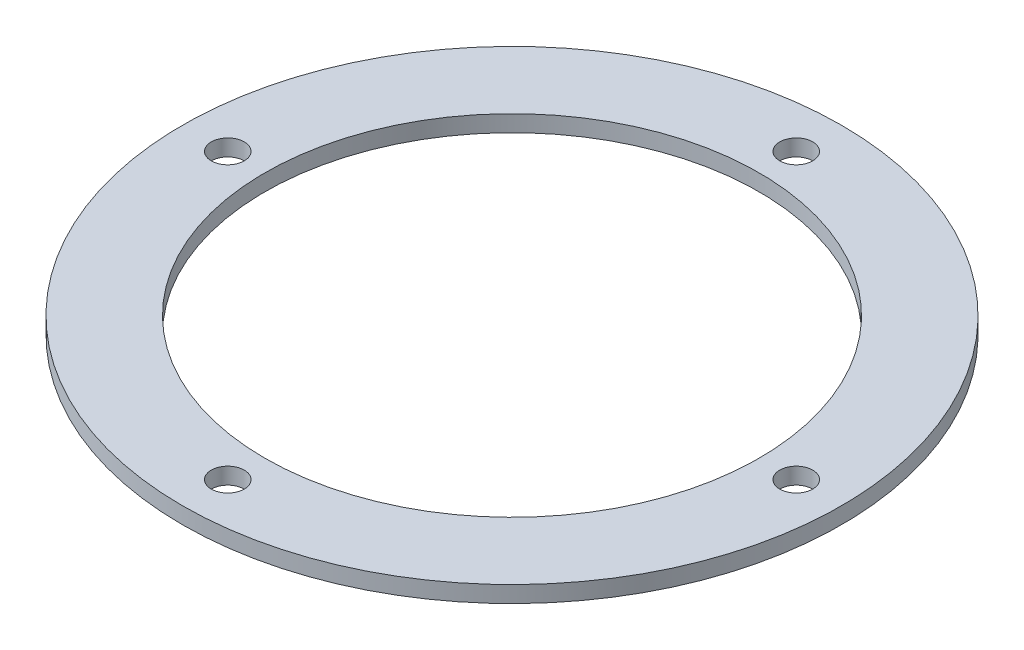
ISO-10303-21;
HEADER;
FILE_DESCRIPTION(('STEP AP214'),'2;1');
FILE_NAME('part.step','',(''),(''),'','','');
FILE_SCHEMA(('AUTOMOTIVE_DESIGN { 1 0 10303 214 1 1 1 1 }'));
ENDSEC;
DATA;
#1=APPLICATION_CONTEXT('core data for automotive mechanical design processes');
#2=APPLICATION_PROTOCOL_DEFINITION('international standard','automotive_design',2000,#1);
#3=PRODUCT_CONTEXT('',#1,'mechanical');
#4=PRODUCT('Part','Part','',(#3));
#5=PRODUCT_RELATED_PRODUCT_CATEGORY('part','',(#4));
#6=PRODUCT_DEFINITION_FORMATION('','',#4);
#7=PRODUCT_DEFINITION_CONTEXT('part definition',#1,'design');
#8=PRODUCT_DEFINITION('design','',#6,#7);
#9=PRODUCT_DEFINITION_SHAPE('','',#8);
#10=(LENGTH_UNIT() NAMED_UNIT(*) SI_UNIT(.MILLI.,.METRE.));
#11=(NAMED_UNIT(*) PLANE_ANGLE_UNIT() SI_UNIT($,.RADIAN.));
#12=(NAMED_UNIT(*) SI_UNIT($,.STERADIAN.) SOLID_ANGLE_UNIT());
#13=UNCERTAINTY_MEASURE_WITH_UNIT(LENGTH_MEASURE(1.E-05),#10,'distance_accuracy_value','');
#14=(GEOMETRIC_REPRESENTATION_CONTEXT(3) GLOBAL_UNCERTAINTY_ASSIGNED_CONTEXT((#13)) GLOBAL_UNIT_ASSIGNED_CONTEXT((#10,
#11,#12)) REPRESENTATION_CONTEXT('',''));
#15=CARTESIAN_POINT('',(0.,0.,0.));
#16=DIRECTION('',(0.,0.,1.));
#17=DIRECTION('',(1.,0.,0.));
#18=AXIS2_PLACEMENT_3D('',#15,#16,#17);
#19=CARTESIAN_POINT('',(0.,2.,0.));
#20=DIRECTION('',(0.,1.,0.));
#21=DIRECTION('',(0.,0.,1.));
#22=AXIS2_PLACEMENT_3D('',#19,#20,#21);
#23=PLANE('',#22);
#24=CARTESIAN_POINT('',(1.9484228563267E-12,2.,34.5));
#25=DIRECTION('',(0.,1.,0.));
#26=DIRECTION('',(0.,0.,1.));
#27=AXIS2_PLACEMENT_3D('',#24,#25,#26);
#28=CIRCLE('',#27,2.);
#29=CARTESIAN_POINT('',(1.9484228563267E-12,2.,36.5));
#30=VERTEX_POINT('',#29);
#31=EDGE_CURVE('E66',#30,#30,#28,.T.);
#32=ORIENTED_EDGE('',*,*,#31,.F.);
#33=EDGE_LOOP('',(#32));
#34=FACE_BOUND('',#33,.T.);
#35=CARTESIAN_POINT('',(0.,2.,-34.5));
#36=DIRECTION('',(0.,1.,0.));
#37=DIRECTION('',(0.,0.,1.));
#38=AXIS2_PLACEMENT_3D('',#35,#36,#37);
#39=CIRCLE('',#38,2.);
#40=CARTESIAN_POINT('',(0.,2.,-32.5));
#41=VERTEX_POINT('',#40);
#42=EDGE_CURVE('E54',#41,#41,#39,.T.);
#43=ORIENTED_EDGE('',*,*,#42,.F.);
#44=EDGE_LOOP('',(#43));
#45=FACE_BOUND('',#44,.T.);
#46=CARTESIAN_POINT('',(0.,2.,0.));
#47=DIRECTION('',(0.,1.,0.));
#48=DIRECTION('',(0.,0.,1.));
#49=AXIS2_PLACEMENT_3D('',#46,#47,#48);
#50=CIRCLE('',#49,40.);
#51=CARTESIAN_POINT('',(0.,2.,40.));
#52=VERTEX_POINT('',#51);
#53=EDGE_CURVE('E10',#52,#52,#50,.T.);
#54=ORIENTED_EDGE('',*,*,#53,.T.);
#55=EDGE_LOOP('',(#54));
#56=FACE_BOUND('',#55,.T.);
#57=CARTESIAN_POINT('',(0.,2.,0.));
#58=DIRECTION('',(0.,1.,0.));
#59=DIRECTION('',(0.,0.,1.));
#60=AXIS2_PLACEMENT_3D('',#57,#58,#59);
#61=CIRCLE('',#60,30.);
#62=CARTESIAN_POINT('',(0.,2.,30.));
#63=VERTEX_POINT('',#62);
#64=EDGE_CURVE('E49',#63,#63,#61,.T.);
#65=ORIENTED_EDGE('',*,*,#64,.F.);
#66=EDGE_LOOP('',(#65));
#67=FACE_BOUND('',#66,.T.);
#68=CARTESIAN_POINT('',(34.500000000001,2.,-9.74211428163351E-13));
#69=DIRECTION('',(0.,1.,0.));
#70=DIRECTION('',(0.,0.,1.));
#71=AXIS2_PLACEMENT_3D('',#68,#69,#70);
#72=CIRCLE('',#71,2.);
#73=CARTESIAN_POINT('',(34.500000000001,2.,1.99999999999903));
#74=VERTEX_POINT('',#73);
#75=EDGE_CURVE('E60',#74,#74,#72,.T.);
#76=ORIENTED_EDGE('',*,*,#75,.F.);
#77=EDGE_LOOP('',(#76));
#78=FACE_BOUND('',#77,.T.);
#79=CARTESIAN_POINT('',(-34.499999999999,2.,9.78436459620409E-13));
#80=DIRECTION('',(0.,1.,0.));
#81=DIRECTION('',(0.,0.,1.));
#82=AXIS2_PLACEMENT_3D('',#79,#80,#81);
#83=CIRCLE('',#82,2.);
#84=CARTESIAN_POINT('',(-34.499999999999,2.,2.00000000000098));
#85=VERTEX_POINT('',#84);
#86=EDGE_CURVE('E72',#85,#85,#83,.T.);
#87=ORIENTED_EDGE('',*,*,#86,.F.);
#88=EDGE_LOOP('',(#87));
#89=FACE_BOUND('',#88,.T.);
#90=ADVANCED_FACE('F38',(#34,#45,#56,#67,#78,#89),#23,.T.);
#91=CARTESIAN_POINT('',(0.,0.,0.));
#92=DIRECTION('',(0.,1.,0.));
#93=DIRECTION('',(0.,0.,1.));
#94=AXIS2_PLACEMENT_3D('',#91,#92,#93);
#95=PLANE('',#94);
#96=CARTESIAN_POINT('',(0.,0.,0.));
#97=DIRECTION('',(0.,1.,0.));
#98=DIRECTION('',(0.,0.,1.));
#99=AXIS2_PLACEMENT_3D('',#96,#97,#98);
#100=CIRCLE('',#99,40.);
#101=CARTESIAN_POINT('',(0.,0.,40.));
#102=VERTEX_POINT('',#101);
#103=EDGE_CURVE('E42',#102,#102,#100,.T.);
#104=ORIENTED_EDGE('',*,*,#103,.F.);
#105=EDGE_LOOP('',(#104));
#106=FACE_BOUND('',#105,.T.);
#107=CARTESIAN_POINT('',(0.,0.,0.));
#108=DIRECTION('',(0.,1.,0.));
#109=DIRECTION('',(0.,0.,1.));
#110=AXIS2_PLACEMENT_3D('',#107,#108,#109);
#111=CIRCLE('',#110,30.);
#112=CARTESIAN_POINT('',(0.,0.,30.));
#113=VERTEX_POINT('',#112);
#114=EDGE_CURVE('E51',#113,#113,#111,.T.);
#115=ORIENTED_EDGE('',*,*,#114,.T.);
#116=EDGE_LOOP('',(#115));
#117=FACE_BOUND('',#116,.T.);
#118=CARTESIAN_POINT('',(0.,0.,-34.5));
#119=DIRECTION('',(0.,1.,0.));
#120=DIRECTION('',(0.,0.,1.));
#121=AXIS2_PLACEMENT_3D('',#118,#119,#120);
#122=CIRCLE('',#121,2.);
#123=CARTESIAN_POINT('',(0.,0.,-32.5));
#124=VERTEX_POINT('',#123);
#125=EDGE_CURVE('E57',#124,#124,#122,.T.);
#126=ORIENTED_EDGE('',*,*,#125,.T.);
#127=EDGE_LOOP('',(#126));
#128=FACE_BOUND('',#127,.T.);
#129=CARTESIAN_POINT('',(34.500000000001,0.,-9.74211428163351E-13));
#130=DIRECTION('',(0.,1.,0.));
#131=DIRECTION('',(0.,0.,1.));
#132=AXIS2_PLACEMENT_3D('',#129,#130,#131);
#133=CIRCLE('',#132,2.);
#134=CARTESIAN_POINT('',(34.500000000001,0.,1.99999999999903));
#135=VERTEX_POINT('',#134);
#136=EDGE_CURVE('E63',#135,#135,#133,.T.);
#137=ORIENTED_EDGE('',*,*,#136,.T.);
#138=EDGE_LOOP('',(#137));
#139=FACE_BOUND('',#138,.T.);
#140=CARTESIAN_POINT('',(1.9484228563267E-12,0.,34.5));
#141=DIRECTION('',(0.,1.,0.));
#142=DIRECTION('',(0.,0.,1.));
#143=AXIS2_PLACEMENT_3D('',#140,#141,#142);
#144=CIRCLE('',#143,2.);
#145=CARTESIAN_POINT('',(1.9484228563267E-12,0.,36.5));
#146=VERTEX_POINT('',#145);
#147=EDGE_CURVE('E69',#146,#146,#144,.T.);
#148=ORIENTED_EDGE('',*,*,#147,.T.);
#149=EDGE_LOOP('',(#148));
#150=FACE_BOUND('',#149,.T.);
#151=CARTESIAN_POINT('',(-34.499999999999,0.,9.78436459620409E-13));
#152=DIRECTION('',(0.,1.,0.));
#153=DIRECTION('',(0.,0.,1.));
#154=AXIS2_PLACEMENT_3D('',#151,#152,#153);
#155=CIRCLE('',#154,2.);
#156=CARTESIAN_POINT('',(-34.499999999999,0.,2.00000000000098));
#157=VERTEX_POINT('',#156);
#158=EDGE_CURVE('E75',#157,#157,#155,.T.);
#159=ORIENTED_EDGE('',*,*,#158,.T.);
#160=EDGE_LOOP('',(#159));
#161=FACE_BOUND('',#160,.T.);
#162=ADVANCED_FACE('F85',(#106,#117,#128,#139,#150,#161),#95,.F.);
#163=CARTESIAN_POINT('',(0.,2.,0.));
#164=DIRECTION('',(0.,-1.,0.));
#165=DIRECTION('',(0.,0.,-1.));
#166=AXIS2_PLACEMENT_3D('',#163,#164,#165);
#167=CYLINDRICAL_SURFACE('',#166,40.);
#168=ORIENTED_EDGE('',*,*,#53,.F.);
#169=EDGE_LOOP('',(#168));
#170=FACE_BOUND('',#169,.T.);
#171=ORIENTED_EDGE('',*,*,#103,.T.);
#172=EDGE_LOOP('',(#171));
#173=FACE_BOUND('',#172,.T.);
#174=ADVANCED_FACE('F40',(#170,#173),#167,.T.);
#175=CARTESIAN_POINT('',(0.,2.,0.));
#176=DIRECTION('',(0.,-1.,0.));
#177=DIRECTION('',(0.,0.,-1.));
#178=AXIS2_PLACEMENT_3D('',#175,#176,#177);
#179=CYLINDRICAL_SURFACE('',#178,30.);
#180=ORIENTED_EDGE('',*,*,#64,.T.);
#181=EDGE_LOOP('',(#180));
#182=FACE_BOUND('',#181,.T.);
#183=ORIENTED_EDGE('',*,*,#114,.F.);
#184=EDGE_LOOP('',(#183));
#185=FACE_BOUND('',#184,.T.);
#186=ADVANCED_FACE('F95',(#182,#185),#179,.F.);
#187=CARTESIAN_POINT('',(0.,2.,-34.5));
#188=DIRECTION('',(0.,-1.,0.));
#189=DIRECTION('',(0.,0.,-1.));
#190=AXIS2_PLACEMENT_3D('',#187,#188,#189);
#191=CYLINDRICAL_SURFACE('',#190,2.);
#192=ORIENTED_EDGE('',*,*,#42,.T.);
#193=EDGE_LOOP('',(#192));
#194=FACE_BOUND('',#193,.T.);
#195=ORIENTED_EDGE('',*,*,#125,.F.);
#196=EDGE_LOOP('',(#195));
#197=FACE_BOUND('',#196,.T.);
#198=ADVANCED_FACE('F98',(#194,#197),#191,.F.);
#199=CARTESIAN_POINT('',(34.500000000001,2.,-9.74211428163351E-13));
#200=DIRECTION('',(0.,-1.,0.));
#201=DIRECTION('',(0.,0.,-1.));
#202=AXIS2_PLACEMENT_3D('',#199,#200,#201);
#203=CYLINDRICAL_SURFACE('',#202,2.);
#204=ORIENTED_EDGE('',*,*,#75,.T.);
#205=EDGE_LOOP('',(#204));
#206=FACE_BOUND('',#205,.T.);
#207=ORIENTED_EDGE('',*,*,#136,.F.);
#208=EDGE_LOOP('',(#207));
#209=FACE_BOUND('',#208,.T.);
#210=ADVANCED_FACE('F102',(#206,#209),#203,.F.);
#211=CARTESIAN_POINT('',(1.9484228563267E-12,2.,34.5));
#212=DIRECTION('',(0.,-1.,0.));
#213=DIRECTION('',(0.,0.,-1.));
#214=AXIS2_PLACEMENT_3D('',#211,#212,#213);
#215=CYLINDRICAL_SURFACE('',#214,2.);
#216=ORIENTED_EDGE('',*,*,#31,.T.);
#217=EDGE_LOOP('',(#216));
#218=FACE_BOUND('',#217,.T.);
#219=ORIENTED_EDGE('',*,*,#147,.F.);
#220=EDGE_LOOP('',(#219));
#221=FACE_BOUND('',#220,.T.);
#222=ADVANCED_FACE('F106',(#218,#221),#215,.F.);
#223=CARTESIAN_POINT('',(-34.499999999999,2.,9.78436459620409E-13));
#224=DIRECTION('',(0.,-1.,0.));
#225=DIRECTION('',(0.,0.,-1.));
#226=AXIS2_PLACEMENT_3D('',#223,#224,#225);
#227=CYLINDRICAL_SURFACE('',#226,2.);
#228=ORIENTED_EDGE('',*,*,#86,.T.);
#229=EDGE_LOOP('',(#228));
#230=FACE_BOUND('',#229,.T.);
#231=ORIENTED_EDGE('',*,*,#158,.F.);
#232=EDGE_LOOP('',(#231));
#233=FACE_BOUND('',#232,.T.);
#234=ADVANCED_FACE('F81',(#230,#233),#227,.F.);
#235=CLOSED_SHELL('',(#90,#162,#174,#186,#198,#210,#222,#234));
#236=MANIFOLD_SOLID_BREP('B2',#235);
#237=ADVANCED_BREP_SHAPE_REPRESENTATION('',(#18,#236),#14);
#238=SHAPE_DEFINITION_REPRESENTATION(#9,#237);
ENDSEC;
END-ISO-10303-21;
